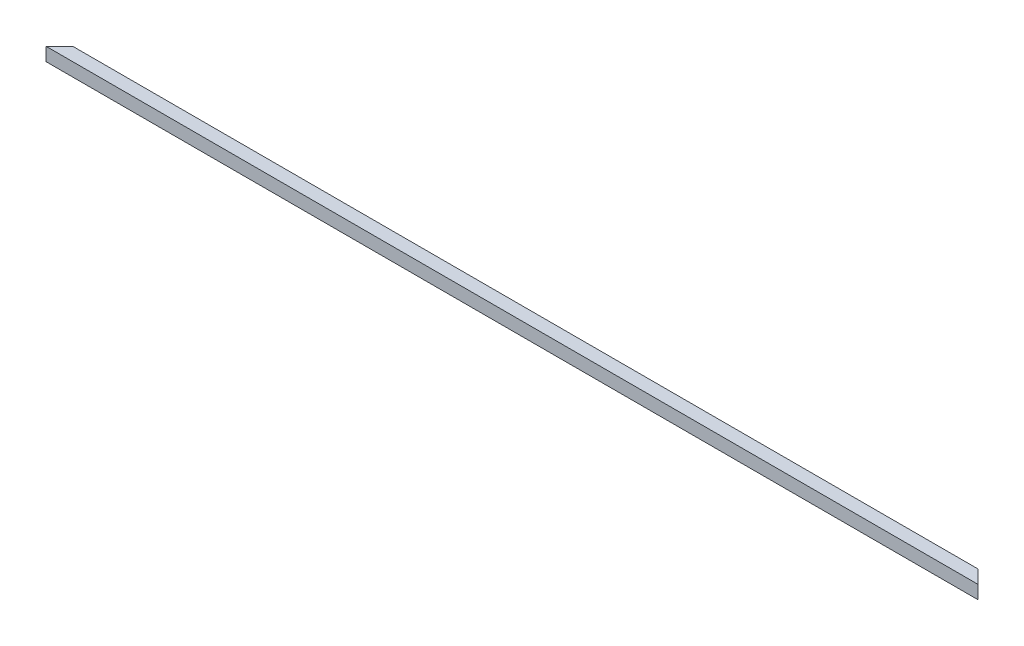
ISO-10303-21;
HEADER;
FILE_DESCRIPTION(('STEP AP214'),'2;1');
FILE_NAME('part.step','',(''),(''),'','','');
FILE_SCHEMA(('AUTOMOTIVE_DESIGN { 1 0 10303 214 1 1 1 1 }'));
ENDSEC;
DATA;
#1=APPLICATION_CONTEXT('core data for automotive mechanical design processes');
#2=APPLICATION_PROTOCOL_DEFINITION('international standard','automotive_design',2000,#1);
#3=PRODUCT_CONTEXT('',#1,'mechanical');
#4=PRODUCT('Part','Part','',(#3));
#5=PRODUCT_RELATED_PRODUCT_CATEGORY('part','',(#4));
#6=PRODUCT_DEFINITION_FORMATION('','',#4);
#7=PRODUCT_DEFINITION_CONTEXT('part definition',#1,'design');
#8=PRODUCT_DEFINITION('design','',#6,#7);
#9=PRODUCT_DEFINITION_SHAPE('','',#8);
#10=(LENGTH_UNIT() NAMED_UNIT(*) SI_UNIT(.MILLI.,.METRE.));
#11=(NAMED_UNIT(*) PLANE_ANGLE_UNIT() SI_UNIT($,.RADIAN.));
#12=(NAMED_UNIT(*) SI_UNIT($,.STERADIAN.) SOLID_ANGLE_UNIT());
#13=UNCERTAINTY_MEASURE_WITH_UNIT(LENGTH_MEASURE(1.E-05),#10,'distance_accuracy_value','');
#14=(GEOMETRIC_REPRESENTATION_CONTEXT(3) GLOBAL_UNCERTAINTY_ASSIGNED_CONTEXT((#13)) GLOBAL_UNIT_ASSIGNED_CONTEXT((#10,
#11,#12)) REPRESENTATION_CONTEXT('',''));
#15=CARTESIAN_POINT('',(0.,0.,0.));
#16=DIRECTION('',(0.,0.,1.));
#17=DIRECTION('',(1.,0.,0.));
#18=AXIS2_PLACEMENT_3D('',#15,#16,#17);
#19=CARTESIAN_POINT('',(20.,20.,-19.9999999999998));
#20=DIRECTION('',(0.707106781186544,0.,0.707106781186551));
#21=DIRECTION('',(0.707106781186551,0.,-0.707106781186544));
#22=AXIS2_PLACEMENT_3D('',#19,#20,#21);
#23=PLANE('',#22);
#24=DIRECTION('',(-0.707106781186551,0.,0.707106781186544));
#25=VECTOR('',#24,1.);
#26=CARTESIAN_POINT('',(20.,0.,-19.9999999999998));
#27=LINE('',#26,#25);
#28=CARTESIAN_POINT('',(20.,0.,-19.9999999999998));
#29=VERTEX_POINT('',#28);
#30=CARTESIAN_POINT('',(0.,0.,0.));
#31=VERTEX_POINT('',#30);
#32=EDGE_CURVE('E96',#29,#31,#27,.T.);
#33=ORIENTED_EDGE('',*,*,#32,.T.);
#34=DIRECTION('',(0.,-1.,0.));
#35=VECTOR('',#34,1.);
#36=CARTESIAN_POINT('',(0.,20.,0.));
#37=LINE('',#36,#35);
#38=CARTESIAN_POINT('',(0.,20.,0.));
#39=VERTEX_POINT('',#38);
#40=EDGE_CURVE('E11',#39,#31,#37,.T.);
#41=ORIENTED_EDGE('',*,*,#40,.F.);
#42=DIRECTION('',(-0.707106781186551,0.,0.707106781186544));
#43=VECTOR('',#42,1.);
#44=CARTESIAN_POINT('',(20.,20.,-19.9999999999998));
#45=LINE('',#44,#43);
#46=CARTESIAN_POINT('',(20.,20.,-19.9999999999998));
#47=VERTEX_POINT('',#46);
#48=EDGE_CURVE('E84',#47,#39,#45,.T.);
#49=ORIENTED_EDGE('',*,*,#48,.F.);
#50=DIRECTION('',(0.,-1.,0.));
#51=VECTOR('',#50,1.);
#52=CARTESIAN_POINT('',(20.,20.,-19.9999999999998));
#53=LINE('',#52,#51);
#54=EDGE_CURVE('E92',#47,#29,#53,.T.);
#55=ORIENTED_EDGE('',*,*,#54,.T.);
#56=EDGE_LOOP('',(#33,#41,#49,#55));
#57=FACE_BOUND('',#56,.T.);
#58=ADVANCED_FACE('F33',(#57),#23,.F.);
#59=CARTESIAN_POINT('',(0.,20.,0.));
#60=DIRECTION('',(0.,0.,-1.));
#61=DIRECTION('',(-1.,0.,0.));
#62=AXIS2_PLACEMENT_3D('',#59,#60,#61);
#63=PLANE('',#62);
#64=DIRECTION('',(1.,0.,0.));
#65=VECTOR('',#64,1.);
#66=CARTESIAN_POINT('',(0.,0.,0.));
#67=LINE('',#66,#65);
#68=CARTESIAN_POINT('',(1397.,0.,0.));
#69=VERTEX_POINT('',#68);
#70=EDGE_CURVE('E88',#31,#69,#67,.T.);
#71=ORIENTED_EDGE('',*,*,#70,.T.);
#72=DIRECTION('',(0.,-1.,0.));
#73=VECTOR('',#72,1.);
#74=CARTESIAN_POINT('',(1397.,20.,0.));
#75=LINE('',#74,#73);
#76=CARTESIAN_POINT('',(1397.,20.,0.));
#77=VERTEX_POINT('',#76);
#78=EDGE_CURVE('E41',#77,#69,#75,.T.);
#79=ORIENTED_EDGE('',*,*,#78,.F.);
#80=DIRECTION('',(1.,0.,0.));
#81=VECTOR('',#80,1.);
#82=CARTESIAN_POINT('',(0.,20.,0.));
#83=LINE('',#82,#81);
#84=EDGE_CURVE('E79',#39,#77,#83,.T.);
#85=ORIENTED_EDGE('',*,*,#84,.F.);
#86=ORIENTED_EDGE('',*,*,#40,.T.);
#87=EDGE_LOOP('',(#71,#79,#85,#86));
#88=FACE_BOUND('',#87,.T.);
#89=ADVANCED_FACE('F87',(#88),#63,.F.);
#90=CARTESIAN_POINT('',(1397.,20.,0.));
#91=DIRECTION('',(-0.707106781186543,0.,0.707106781186552));
#92=DIRECTION('',(0.707106781186552,0.,0.707106781186543));
#93=AXIS2_PLACEMENT_3D('',#90,#91,#92);
#94=PLANE('',#93);
#95=DIRECTION('',(-0.707106781186552,0.,-0.707106781186543));
#96=VECTOR('',#95,1.);
#97=CARTESIAN_POINT('',(1397.,0.,0.));
#98=LINE('',#97,#96);
#99=CARTESIAN_POINT('',(1377.,0.,-20.));
#100=VERTEX_POINT('',#99);
#101=EDGE_CURVE('E66',#69,#100,#98,.T.);
#102=ORIENTED_EDGE('',*,*,#101,.T.);
#103=DIRECTION('',(0.,-1.,0.));
#104=VECTOR('',#103,1.);
#105=CARTESIAN_POINT('',(1377.,20.,-20.));
#106=LINE('',#105,#104);
#107=CARTESIAN_POINT('',(1377.,20.,-20.));
#108=VERTEX_POINT('',#107);
#109=EDGE_CURVE('E89',#108,#100,#106,.T.);
#110=ORIENTED_EDGE('',*,*,#109,.F.);
#111=DIRECTION('',(-0.707106781186552,0.,-0.707106781186543));
#112=VECTOR('',#111,1.);
#113=CARTESIAN_POINT('',(1397.,20.,0.));
#114=LINE('',#113,#112);
#115=EDGE_CURVE('E82',#77,#108,#114,.T.);
#116=ORIENTED_EDGE('',*,*,#115,.F.);
#117=ORIENTED_EDGE('',*,*,#78,.T.);
#118=EDGE_LOOP('',(#102,#110,#116,#117));
#119=FACE_BOUND('',#118,.T.);
#120=ADVANCED_FACE('F90',(#119),#94,.F.);
#121=CARTESIAN_POINT('',(1377.,20.,-20.));
#122=DIRECTION('',(0.,0.,1.));
#123=DIRECTION('',(1.,0.,0.));
#124=AXIS2_PLACEMENT_3D('',#121,#122,#123);
#125=PLANE('',#124);
#126=DIRECTION('',(-1.,0.,0.));
#127=VECTOR('',#126,1.);
#128=CARTESIAN_POINT('',(1377.,0.,-20.));
#129=LINE('',#128,#127);
#130=EDGE_CURVE('E72',#100,#29,#129,.T.);
#131=ORIENTED_EDGE('',*,*,#130,.T.);
#132=ORIENTED_EDGE('',*,*,#54,.F.);
#133=DIRECTION('',(-1.,0.,0.));
#134=VECTOR('',#133,1.);
#135=CARTESIAN_POINT('',(1377.,20.,-20.));
#136=LINE('',#135,#134);
#137=EDGE_CURVE('E49',#108,#47,#136,.T.);
#138=ORIENTED_EDGE('',*,*,#137,.F.);
#139=ORIENTED_EDGE('',*,*,#109,.T.);
#140=EDGE_LOOP('',(#131,#132,#138,#139));
#141=FACE_BOUND('',#140,.T.);
#142=ADVANCED_FACE('F103',(#141),#125,.F.);
#143=CARTESIAN_POINT('',(0.,20.,0.));
#144=DIRECTION('',(0.,-1.,0.));
#145=DIRECTION('',(0.,0.,-1.));
#146=AXIS2_PLACEMENT_3D('',#143,#144,#145);
#147=PLANE('',#146);
#148=ORIENTED_EDGE('',*,*,#48,.T.);
#149=ORIENTED_EDGE('',*,*,#84,.T.);
#150=ORIENTED_EDGE('',*,*,#115,.T.);
#151=ORIENTED_EDGE('',*,*,#137,.T.);
#152=EDGE_LOOP('',(#148,#149,#150,#151));
#153=FACE_BOUND('',#152,.T.);
#154=ADVANCED_FACE('F80',(#153),#147,.F.);
#155=CARTESIAN_POINT('',(0.,0.,0.));
#156=DIRECTION('',(0.,-1.,0.));
#157=DIRECTION('',(0.,0.,-1.));
#158=AXIS2_PLACEMENT_3D('',#155,#156,#157);
#159=PLANE('',#158);
#160=ORIENTED_EDGE('',*,*,#32,.F.);
#161=ORIENTED_EDGE('',*,*,#130,.F.);
#162=ORIENTED_EDGE('',*,*,#101,.F.);
#163=ORIENTED_EDGE('',*,*,#70,.F.);
#164=EDGE_LOOP('',(#160,#161,#162,#163));
#165=FACE_BOUND('',#164,.T.);
#166=ADVANCED_FACE('F106',(#165),#159,.T.);
#167=CLOSED_SHELL('',(#58,#89,#120,#142,#154,#166));
#168=MANIFOLD_SOLID_BREP('B2',#167);
#169=ADVANCED_BREP_SHAPE_REPRESENTATION('',(#18,#168),#14);
#170=SHAPE_DEFINITION_REPRESENTATION(#9,#169);
ENDSEC;
END-ISO-10303-21;
